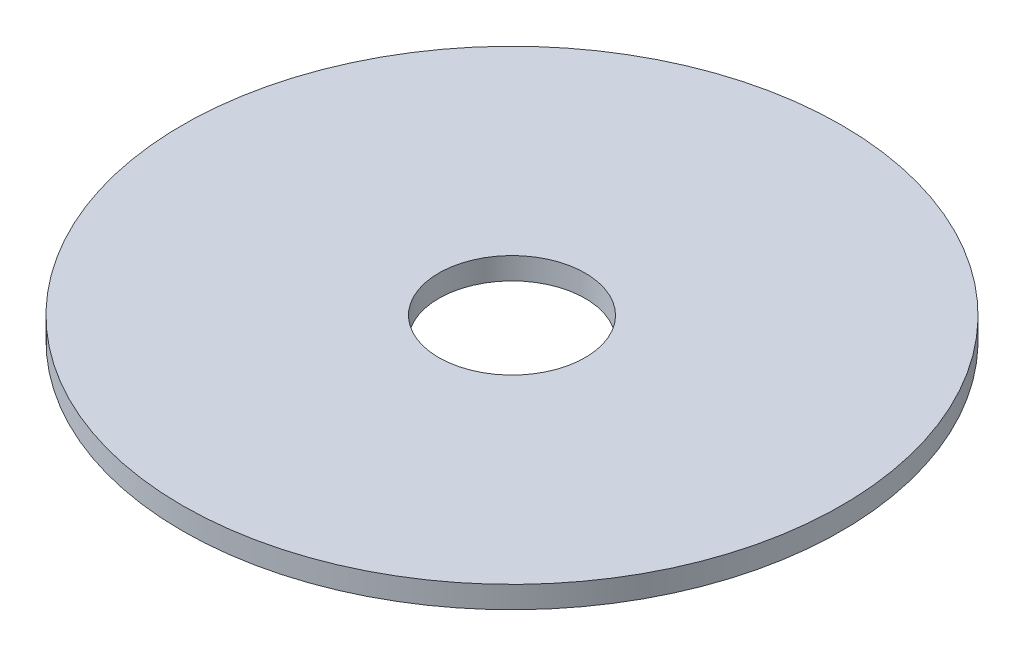
ISO-10303-21;
HEADER;
FILE_DESCRIPTION(('STEP AP214'),'2;1');
FILE_NAME('part.step','',(''),(''),'','','');
FILE_SCHEMA(('AUTOMOTIVE_DESIGN { 1 0 10303 214 1 1 1 1 }'));
ENDSEC;
DATA;
#1=APPLICATION_CONTEXT('core data for automotive mechanical design processes');
#2=APPLICATION_PROTOCOL_DEFINITION('international standard','automotive_design',2000,#1);
#3=PRODUCT_CONTEXT('',#1,'mechanical');
#4=PRODUCT('Part','Part','',(#3));
#5=PRODUCT_RELATED_PRODUCT_CATEGORY('part','',(#4));
#6=PRODUCT_DEFINITION_FORMATION('','',#4);
#7=PRODUCT_DEFINITION_CONTEXT('part definition',#1,'design');
#8=PRODUCT_DEFINITION('design','',#6,#7);
#9=PRODUCT_DEFINITION_SHAPE('','',#8);
#10=(LENGTH_UNIT() NAMED_UNIT(*) SI_UNIT(.MILLI.,.METRE.));
#11=(NAMED_UNIT(*) PLANE_ANGLE_UNIT() SI_UNIT($,.RADIAN.));
#12=(NAMED_UNIT(*) SI_UNIT($,.STERADIAN.) SOLID_ANGLE_UNIT());
#13=UNCERTAINTY_MEASURE_WITH_UNIT(LENGTH_MEASURE(1.E-05),#10,'distance_accuracy_value','');
#14=(GEOMETRIC_REPRESENTATION_CONTEXT(3) GLOBAL_UNCERTAINTY_ASSIGNED_CONTEXT((#13)) GLOBAL_UNIT_ASSIGNED_CONTEXT((#10,
#11,#12)) REPRESENTATION_CONTEXT('',''));
#15=CARTESIAN_POINT('',(0.,0.,0.));
#16=DIRECTION('',(0.,0.,1.));
#17=DIRECTION('',(1.,0.,0.));
#18=AXIS2_PLACEMENT_3D('',#15,#16,#17);
#19=CARTESIAN_POINT('',(0.,1.5,0.));
#20=DIRECTION('',(0.,1.,0.));
#21=DIRECTION('',(0.,0.,1.));
#22=AXIS2_PLACEMENT_3D('',#19,#20,#21);
#23=PLANE('',#22);
#24=CARTESIAN_POINT('',(0.,1.5,0.));
#25=DIRECTION('',(0.,1.,0.));
#26=DIRECTION('',(0.,0.,1.));
#27=AXIS2_PLACEMENT_3D('',#24,#25,#26);
#28=CIRCLE('',#27,45.);
#29=CARTESIAN_POINT('',(0.,1.5,45.));
#30=VERTEX_POINT('',#29);
#31=EDGE_CURVE('E10',#30,#30,#28,.T.);
#32=ORIENTED_EDGE('',*,*,#31,.T.);
#33=EDGE_LOOP('',(#32));
#34=FACE_BOUND('',#33,.T.);
#35=CARTESIAN_POINT('',(0.,1.5,0.));
#36=DIRECTION('',(0.,1.,0.));
#37=DIRECTION('',(0.,0.,1.));
#38=AXIS2_PLACEMENT_3D('',#35,#36,#37);
#39=CIRCLE('',#38,10.);
#40=CARTESIAN_POINT('',(0.,1.5,10.));
#41=VERTEX_POINT('',#40);
#42=EDGE_CURVE('E54',#41,#41,#39,.T.);
#43=ORIENTED_EDGE('',*,*,#42,.F.);
#44=EDGE_LOOP('',(#43));
#45=FACE_BOUND('',#44,.T.);
#46=ADVANCED_FACE('F41',(#34,#45),#23,.T.);
#47=CARTESIAN_POINT('',(0.,-1.5,0.));
#48=DIRECTION('',(0.,1.,0.));
#49=DIRECTION('',(0.,0.,1.));
#50=AXIS2_PLACEMENT_3D('',#47,#48,#49);
#51=PLANE('',#50);
#52=CARTESIAN_POINT('',(0.,-1.5,0.));
#53=DIRECTION('',(0.,1.,0.));
#54=DIRECTION('',(0.,0.,1.));
#55=AXIS2_PLACEMENT_3D('',#52,#53,#54);
#56=CIRCLE('',#55,45.);
#57=CARTESIAN_POINT('',(0.,-1.5,45.));
#58=VERTEX_POINT('',#57);
#59=EDGE_CURVE('E45',#58,#58,#56,.T.);
#60=ORIENTED_EDGE('',*,*,#59,.F.);
#61=EDGE_LOOP('',(#60));
#62=FACE_BOUND('',#61,.T.);
#63=CARTESIAN_POINT('',(0.,-1.5,0.));
#64=DIRECTION('',(0.,1.,0.));
#65=DIRECTION('',(0.,0.,1.));
#66=AXIS2_PLACEMENT_3D('',#63,#64,#65);
#67=CIRCLE('',#66,10.);
#68=CARTESIAN_POINT('',(0.,-1.5,10.));
#69=VERTEX_POINT('',#68);
#70=EDGE_CURVE('E56',#69,#69,#67,.T.);
#71=ORIENTED_EDGE('',*,*,#70,.T.);
#72=EDGE_LOOP('',(#71));
#73=FACE_BOUND('',#72,.T.);
#74=ADVANCED_FACE('F68',(#62,#73),#51,.F.);
#75=CARTESIAN_POINT('',(0.,1.5,0.));
#76=DIRECTION('',(0.,-1.,0.));
#77=DIRECTION('',(0.,0.,-1.));
#78=AXIS2_PLACEMENT_3D('',#75,#76,#77);
#79=CYLINDRICAL_SURFACE('',#78,45.);
#80=ORIENTED_EDGE('',*,*,#31,.F.);
#81=EDGE_LOOP('',(#80));
#82=FACE_BOUND('',#81,.T.);
#83=ORIENTED_EDGE('',*,*,#59,.T.);
#84=EDGE_LOOP('',(#83));
#85=FACE_BOUND('',#84,.T.);
#86=ADVANCED_FACE('F43',(#82,#85),#79,.T.);
#87=CARTESIAN_POINT('',(0.,1.5,0.));
#88=DIRECTION('',(0.,-1.,0.));
#89=DIRECTION('',(0.,0.,-1.));
#90=AXIS2_PLACEMENT_3D('',#87,#88,#89);
#91=CYLINDRICAL_SURFACE('',#90,10.);
#92=ORIENTED_EDGE('',*,*,#42,.T.);
#93=EDGE_LOOP('',(#92));
#94=FACE_BOUND('',#93,.T.);
#95=ORIENTED_EDGE('',*,*,#70,.F.);
#96=EDGE_LOOP('',(#95));
#97=FACE_BOUND('',#96,.T.);
#98=ADVANCED_FACE('F64',(#94,#97),#91,.F.);
#99=CLOSED_SHELL('',(#46,#74,#86,#98));
#100=MANIFOLD_SOLID_BREP('B2',#99);
#101=ADVANCED_BREP_SHAPE_REPRESENTATION('',(#18,#100),#14);
#102=SHAPE_DEFINITION_REPRESENTATION(#9,#101);
ENDSEC;
END-ISO-10303-21;
